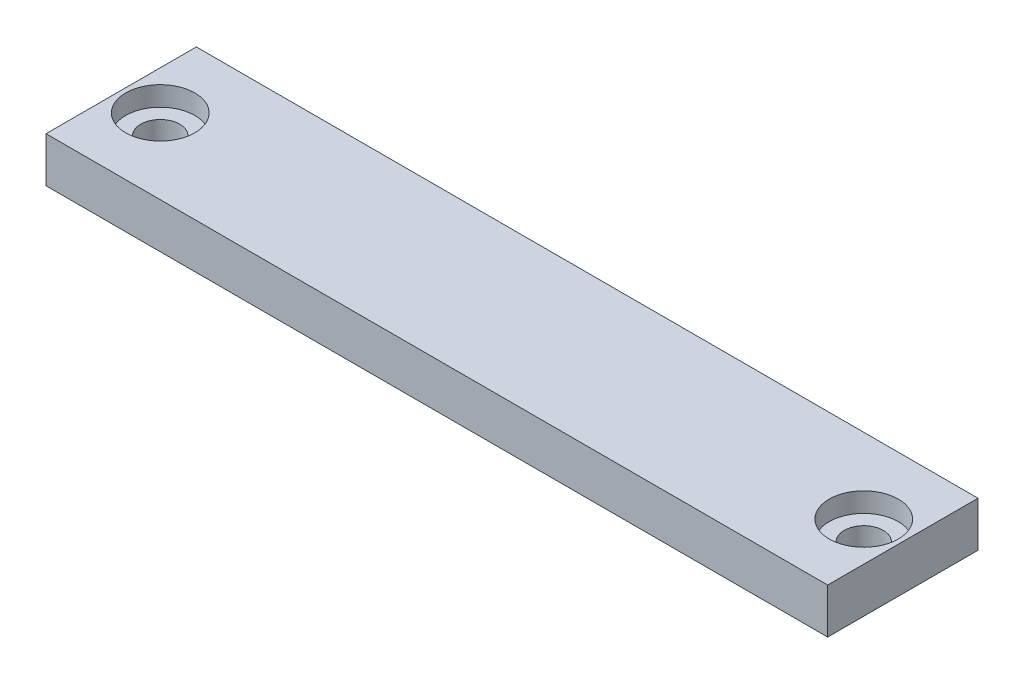
ISO-10303-21;
HEADER;
FILE_DESCRIPTION(('STEP AP214'),'2;1');
FILE_NAME('part.step','',(''),(''),'','','');
FILE_SCHEMA(('AUTOMOTIVE_DESIGN { 1 0 10303 214 1 1 1 1 }'));
ENDSEC;
DATA;
#1=APPLICATION_CONTEXT('core data for automotive mechanical design processes');
#2=APPLICATION_PROTOCOL_DEFINITION('international standard','automotive_design',2000,#1);
#3=PRODUCT_CONTEXT('',#1,'mechanical');
#4=PRODUCT('Part','Part','',(#3));
#5=PRODUCT_RELATED_PRODUCT_CATEGORY('part','',(#4));
#6=PRODUCT_DEFINITION_FORMATION('','',#4);
#7=PRODUCT_DEFINITION_CONTEXT('part definition',#1,'design');
#8=PRODUCT_DEFINITION('design','',#6,#7);
#9=PRODUCT_DEFINITION_SHAPE('','',#8);
#10=(LENGTH_UNIT() NAMED_UNIT(*) SI_UNIT(.MILLI.,.METRE.));
#11=(NAMED_UNIT(*) PLANE_ANGLE_UNIT() SI_UNIT($,.RADIAN.));
#12=(NAMED_UNIT(*) SI_UNIT($,.STERADIAN.) SOLID_ANGLE_UNIT());
#13=UNCERTAINTY_MEASURE_WITH_UNIT(LENGTH_MEASURE(1.E-05),#10,'distance_accuracy_value','');
#14=(GEOMETRIC_REPRESENTATION_CONTEXT(3) GLOBAL_UNCERTAINTY_ASSIGNED_CONTEXT((#13)) GLOBAL_UNIT_ASSIGNED_CONTEXT((#10,
#11,#12)) REPRESENTATION_CONTEXT('',''));
#15=CARTESIAN_POINT('',(0.,0.,0.));
#16=DIRECTION('',(0.,0.,1.));
#17=DIRECTION('',(1.,0.,0.));
#18=AXIS2_PLACEMENT_3D('',#15,#16,#17);
#19=CARTESIAN_POINT('',(23.4,26.,-35.));
#20=DIRECTION('',(0.,-1.,0.));
#21=DIRECTION('',(0.,0.,-1.));
#22=AXIS2_PLACEMENT_3D('',#19,#20,#21);
#23=CYLINDRICAL_SURFACE('',#22,1.3);
#24=CARTESIAN_POINT('',(23.4,21.75,-35.));
#25=DIRECTION('',(0.,1.,0.));
#26=DIRECTION('',(0.,0.,1.));
#27=AXIS2_PLACEMENT_3D('',#24,#25,#26);
#28=CIRCLE('',#27,1.3);
#29=CARTESIAN_POINT('',(23.4,21.75,-33.7));
#30=VERTEX_POINT('',#29);
#31=EDGE_CURVE('E131',#30,#30,#28,.F.);
#32=ORIENTED_EDGE('',*,*,#31,.T.);
#33=EDGE_LOOP('',(#32));
#34=FACE_BOUND('',#33,.T.);
#35=CARTESIAN_POINT('',(23.4,23.45,-35.));
#36=DIRECTION('',(0.,1.,0.));
#37=DIRECTION('',(0.,0.,1.));
#38=AXIS2_PLACEMENT_3D('',#35,#36,#37);
#39=CIRCLE('',#38,1.3);
#40=CARTESIAN_POINT('',(23.4,23.45,-33.7));
#41=VERTEX_POINT('',#40);
#42=EDGE_CURVE('E125',#41,#41,#39,.T.);
#43=ORIENTED_EDGE('',*,*,#42,.T.);
#44=EDGE_LOOP('',(#43));
#45=FACE_BOUND('',#44,.T.);
#46=ADVANCED_FACE('F43',(#34,#45),#23,.F.);
#47=CARTESIAN_POINT('',(-23.4,26.,-35.));
#48=DIRECTION('',(0.,-1.,0.));
#49=DIRECTION('',(0.,0.,-1.));
#50=AXIS2_PLACEMENT_3D('',#47,#48,#49);
#51=CYLINDRICAL_SURFACE('',#50,1.3);
#52=CARTESIAN_POINT('',(-23.4,21.75,-35.));
#53=DIRECTION('',(0.,1.,0.));
#54=DIRECTION('',(0.,0.,1.));
#55=AXIS2_PLACEMENT_3D('',#52,#53,#54);
#56=CIRCLE('',#55,1.3);
#57=CARTESIAN_POINT('',(-23.4,21.75,-33.7));
#58=VERTEX_POINT('',#57);
#59=EDGE_CURVE('E113',#58,#58,#56,.F.);
#60=ORIENTED_EDGE('',*,*,#59,.T.);
#61=EDGE_LOOP('',(#60));
#62=FACE_BOUND('',#61,.T.);
#63=CARTESIAN_POINT('',(-23.4,23.45,-35.));
#64=DIRECTION('',(0.,1.,0.));
#65=DIRECTION('',(0.,0.,1.));
#66=AXIS2_PLACEMENT_3D('',#63,#64,#65);
#67=CIRCLE('',#66,1.3);
#68=CARTESIAN_POINT('',(-23.4,23.45,-33.7));
#69=VERTEX_POINT('',#68);
#70=EDGE_CURVE('E119',#69,#69,#67,.T.);
#71=ORIENTED_EDGE('',*,*,#70,.T.);
#72=EDGE_LOOP('',(#71));
#73=FACE_BOUND('',#72,.T.);
#74=ADVANCED_FACE('F144',(#62,#73),#51,.F.);
#75=CARTESIAN_POINT('',(-26.,21.75,-30.));
#76=DIRECTION('',(1.,0.,0.));
#77=DIRECTION('',(0.,0.,-1.));
#78=AXIS2_PLACEMENT_3D('',#75,#76,#77);
#79=PLANE('',#78);
#80=DIRECTION('',(0.,-1.,0.));
#81=VECTOR('',#80,1.);
#82=CARTESIAN_POINT('',(-26.,21.75,-40.));
#83=LINE('',#82,#81);
#84=CARTESIAN_POINT('',(-26.,24.75,-40.));
#85=VERTEX_POINT('',#84);
#86=CARTESIAN_POINT('',(-26.,21.75,-40.));
#87=VERTEX_POINT('',#86);
#88=EDGE_CURVE('E110',#85,#87,#83,.T.);
#89=ORIENTED_EDGE('',*,*,#88,.T.);
#90=DIRECTION('',(0.,0.,-1.));
#91=VECTOR('',#90,1.);
#92=CARTESIAN_POINT('',(-26.,21.75,-30.));
#93=LINE('',#92,#91);
#94=CARTESIAN_POINT('',(-26.,21.75,-30.));
#95=VERTEX_POINT('',#94);
#96=EDGE_CURVE('E11',#95,#87,#93,.T.);
#97=ORIENTED_EDGE('',*,*,#96,.F.);
#98=DIRECTION('',(0.,-1.,0.));
#99=VECTOR('',#98,1.);
#100=CARTESIAN_POINT('',(-26.,21.75,-30.));
#101=LINE('',#100,#99);
#102=CARTESIAN_POINT('',(-26.,24.75,-30.));
#103=VERTEX_POINT('',#102);
#104=EDGE_CURVE('E97',#103,#95,#101,.T.);
#105=ORIENTED_EDGE('',*,*,#104,.F.);
#106=DIRECTION('',(0.,0.,-1.));
#107=VECTOR('',#106,1.);
#108=CARTESIAN_POINT('',(-26.,24.75,-30.));
#109=LINE('',#108,#107);
#110=EDGE_CURVE('E106',#103,#85,#109,.T.);
#111=ORIENTED_EDGE('',*,*,#110,.T.);
#112=EDGE_LOOP('',(#89,#97,#105,#111));
#113=FACE_BOUND('',#112,.T.);
#114=ADVANCED_FACE('F45',(#113),#79,.F.);
#115=CARTESIAN_POINT('',(-26.,21.75,-30.));
#116=DIRECTION('',(0.,1.,0.));
#117=DIRECTION('',(0.,0.,1.));
#118=AXIS2_PLACEMENT_3D('',#115,#116,#117);
#119=PLANE('',#118);
#120=ORIENTED_EDGE('',*,*,#31,.F.);
#121=EDGE_LOOP('',(#120));
#122=FACE_BOUND('',#121,.T.);
#123=ORIENTED_EDGE('',*,*,#59,.F.);
#124=EDGE_LOOP('',(#123));
#125=FACE_BOUND('',#124,.T.);
#126=DIRECTION('',(1.,0.,0.));
#127=VECTOR('',#126,1.);
#128=CARTESIAN_POINT('',(-26.,21.75,-40.));
#129=LINE('',#128,#127);
#130=CARTESIAN_POINT('',(26.,21.75,-40.));
#131=VERTEX_POINT('',#130);
#132=EDGE_CURVE('E101',#87,#131,#129,.T.);
#133=ORIENTED_EDGE('',*,*,#132,.T.);
#134=DIRECTION('',(0.,0.,-1.));
#135=VECTOR('',#134,1.);
#136=CARTESIAN_POINT('',(26.,21.75,-30.));
#137=LINE('',#136,#135);
#138=CARTESIAN_POINT('',(26.,21.75,-30.));
#139=VERTEX_POINT('',#138);
#140=EDGE_CURVE('E53',#139,#131,#137,.T.);
#141=ORIENTED_EDGE('',*,*,#140,.F.);
#142=DIRECTION('',(1.,0.,0.));
#143=VECTOR('',#142,1.);
#144=CARTESIAN_POINT('',(-26.,21.75,-30.));
#145=LINE('',#144,#143);
#146=EDGE_CURVE('E92',#95,#139,#145,.T.);
#147=ORIENTED_EDGE('',*,*,#146,.F.);
#148=ORIENTED_EDGE('',*,*,#96,.T.);
#149=EDGE_LOOP('',(#133,#141,#147,#148));
#150=FACE_BOUND('',#149,.T.);
#151=ADVANCED_FACE('F100',(#122,#125,#150),#119,.F.);
#152=CARTESIAN_POINT('',(26.,21.75,-30.));
#153=DIRECTION('',(-1.,0.,0.));
#154=DIRECTION('',(0.,0.,1.));
#155=AXIS2_PLACEMENT_3D('',#152,#153,#154);
#156=PLANE('',#155);
#157=DIRECTION('',(0.,1.,0.));
#158=VECTOR('',#157,1.);
#159=CARTESIAN_POINT('',(26.,21.75,-40.));
#160=LINE('',#159,#158);
#161=CARTESIAN_POINT('',(26.,24.75,-40.));
#162=VERTEX_POINT('',#161);
#163=EDGE_CURVE('E79',#131,#162,#160,.T.);
#164=ORIENTED_EDGE('',*,*,#163,.T.);
#165=DIRECTION('',(0.,0.,-1.));
#166=VECTOR('',#165,1.);
#167=CARTESIAN_POINT('',(26.,24.75,-30.));
#168=LINE('',#167,#166);
#169=CARTESIAN_POINT('',(26.,24.75,-30.));
#170=VERTEX_POINT('',#169);
#171=EDGE_CURVE('E102',#170,#162,#168,.T.);
#172=ORIENTED_EDGE('',*,*,#171,.F.);
#173=DIRECTION('',(0.,1.,0.));
#174=VECTOR('',#173,1.);
#175=CARTESIAN_POINT('',(26.,21.75,-30.));
#176=LINE('',#175,#174);
#177=EDGE_CURVE('E95',#139,#170,#176,.T.);
#178=ORIENTED_EDGE('',*,*,#177,.F.);
#179=ORIENTED_EDGE('',*,*,#140,.T.);
#180=EDGE_LOOP('',(#164,#172,#178,#179));
#181=FACE_BOUND('',#180,.T.);
#182=ADVANCED_FACE('F104',(#181),#156,.F.);
#183=CARTESIAN_POINT('',(-26.,24.75,-30.));
#184=DIRECTION('',(0.,-1.,0.));
#185=DIRECTION('',(0.,0.,-1.));
#186=AXIS2_PLACEMENT_3D('',#183,#184,#185);
#187=PLANE('',#186);
#188=CARTESIAN_POINT('',(23.4,24.75,-35.));
#189=DIRECTION('',(0.,-1.,0.));
#190=DIRECTION('',(0.,0.,-1.));
#191=AXIS2_PLACEMENT_3D('',#188,#189,#190);
#192=CIRCLE('',#191,2.3);
#193=CARTESIAN_POINT('',(23.4,24.75,-37.3));
#194=VERTEX_POINT('',#193);
#195=EDGE_CURVE('E47',#194,#194,#192,.F.);
#196=ORIENTED_EDGE('',*,*,#195,.F.);
#197=EDGE_LOOP('',(#196));
#198=FACE_BOUND('',#197,.T.);
#199=CARTESIAN_POINT('',(-23.4,24.75,-35.));
#200=DIRECTION('',(0.,-1.,0.));
#201=DIRECTION('',(0.,0.,-1.));
#202=AXIS2_PLACEMENT_3D('',#199,#200,#201);
#203=CIRCLE('',#202,2.3);
#204=CARTESIAN_POINT('',(-23.4,24.75,-37.3));
#205=VERTEX_POINT('',#204);
#206=EDGE_CURVE('E122',#205,#205,#203,.F.);
#207=ORIENTED_EDGE('',*,*,#206,.F.);
#208=EDGE_LOOP('',(#207));
#209=FACE_BOUND('',#208,.T.);
#210=DIRECTION('',(-1.,0.,0.));
#211=VECTOR('',#210,1.);
#212=CARTESIAN_POINT('',(-26.,24.75,-40.));
#213=LINE('',#212,#211);
#214=EDGE_CURVE('E85',#162,#85,#213,.T.);
#215=ORIENTED_EDGE('',*,*,#214,.T.);
#216=ORIENTED_EDGE('',*,*,#110,.F.);
#217=DIRECTION('',(-1.,0.,0.));
#218=VECTOR('',#217,1.);
#219=CARTESIAN_POINT('',(-26.,24.75,-30.));
#220=LINE('',#219,#218);
#221=EDGE_CURVE('E62',#170,#103,#220,.T.);
#222=ORIENTED_EDGE('',*,*,#221,.F.);
#223=ORIENTED_EDGE('',*,*,#171,.T.);
#224=EDGE_LOOP('',(#215,#216,#222,#223));
#225=FACE_BOUND('',#224,.T.);
#226=ADVANCED_FACE('F155',(#198,#209,#225),#187,.F.);
#227=CARTESIAN_POINT('',(0.,0.,-30.));
#228=DIRECTION('',(0.,0.,-1.));
#229=DIRECTION('',(-1.,0.,0.));
#230=AXIS2_PLACEMENT_3D('',#227,#228,#229);
#231=PLANE('',#230);
#232=ORIENTED_EDGE('',*,*,#104,.T.);
#233=ORIENTED_EDGE('',*,*,#146,.T.);
#234=ORIENTED_EDGE('',*,*,#177,.T.);
#235=ORIENTED_EDGE('',*,*,#221,.T.);
#236=EDGE_LOOP('',(#232,#233,#234,#235));
#237=FACE_BOUND('',#236,.T.);
#238=ADVANCED_FACE('F93',(#237),#231,.F.);
#239=CARTESIAN_POINT('',(0.,0.,-40.));
#240=DIRECTION('',(0.,0.,-1.));
#241=DIRECTION('',(-1.,0.,0.));
#242=AXIS2_PLACEMENT_3D('',#239,#240,#241);
#243=PLANE('',#242);
#244=ORIENTED_EDGE('',*,*,#88,.F.);
#245=ORIENTED_EDGE('',*,*,#214,.F.);
#246=ORIENTED_EDGE('',*,*,#163,.F.);
#247=ORIENTED_EDGE('',*,*,#132,.F.);
#248=EDGE_LOOP('',(#244,#245,#246,#247));
#249=FACE_BOUND('',#248,.T.);
#250=ADVANCED_FACE('F178',(#249),#243,.T.);
#251=CARTESIAN_POINT('',(-23.4,26.,-35.));
#252=DIRECTION('',(0.,-1.,0.));
#253=DIRECTION('',(0.,0.,-1.));
#254=AXIS2_PLACEMENT_3D('',#251,#252,#253);
#255=CYLINDRICAL_SURFACE('',#254,2.3);
#256=CARTESIAN_POINT('',(-23.4,23.45,-35.));
#257=DIRECTION('',(0.,1.,0.));
#258=DIRECTION('',(0.,0.,1.));
#259=AXIS2_PLACEMENT_3D('',#256,#257,#258);
#260=CIRCLE('',#259,2.3);
#261=CARTESIAN_POINT('',(-23.4,23.45,-32.7));
#262=VERTEX_POINT('',#261);
#263=EDGE_CURVE('E123',#262,#262,#260,.T.);
#264=ORIENTED_EDGE('',*,*,#263,.F.);
#265=EDGE_LOOP('',(#264));
#266=FACE_BOUND('',#265,.T.);
#267=ORIENTED_EDGE('',*,*,#206,.T.);
#268=EDGE_LOOP('',(#267));
#269=FACE_BOUND('',#268,.T.);
#270=ADVANCED_FACE('F175',(#266,#269),#255,.F.);
#271=CARTESIAN_POINT('',(-23.4,23.45,-35.));
#272=DIRECTION('',(0.,1.,0.));
#273=DIRECTION('',(0.,0.,1.));
#274=AXIS2_PLACEMENT_3D('',#271,#272,#273);
#275=PLANE('',#274);
#276=ORIENTED_EDGE('',*,*,#70,.F.);
#277=EDGE_LOOP('',(#276));
#278=FACE_BOUND('',#277,.T.);
#279=ORIENTED_EDGE('',*,*,#263,.T.);
#280=EDGE_LOOP('',(#279));
#281=FACE_BOUND('',#280,.T.);
#282=ADVANCED_FACE('F172',(#278,#281),#275,.T.);
#283=CARTESIAN_POINT('',(23.4,26.,-35.));
#284=DIRECTION('',(0.,-1.,0.));
#285=DIRECTION('',(0.,0.,-1.));
#286=AXIS2_PLACEMENT_3D('',#283,#284,#285);
#287=CYLINDRICAL_SURFACE('',#286,2.3);
#288=CARTESIAN_POINT('',(23.4,23.45,-35.));
#289=DIRECTION('',(0.,1.,0.));
#290=DIRECTION('',(0.,0.,1.));
#291=AXIS2_PLACEMENT_3D('',#288,#289,#290);
#292=CIRCLE('',#291,2.3);
#293=CARTESIAN_POINT('',(23.4,23.45,-32.7));
#294=VERTEX_POINT('',#293);
#295=EDGE_CURVE('E127',#294,#294,#292,.T.);
#296=ORIENTED_EDGE('',*,*,#295,.F.);
#297=EDGE_LOOP('',(#296));
#298=FACE_BOUND('',#297,.T.);
#299=ORIENTED_EDGE('',*,*,#195,.T.);
#300=EDGE_LOOP('',(#299));
#301=FACE_BOUND('',#300,.T.);
#302=ADVANCED_FACE('F170',(#298,#301),#287,.F.);
#303=CARTESIAN_POINT('',(23.4,23.45,-35.));
#304=DIRECTION('',(0.,1.,0.));
#305=DIRECTION('',(0.,0.,1.));
#306=AXIS2_PLACEMENT_3D('',#303,#304,#305);
#307=PLANE('',#306);
#308=ORIENTED_EDGE('',*,*,#42,.F.);
#309=EDGE_LOOP('',(#308));
#310=FACE_BOUND('',#309,.T.);
#311=ORIENTED_EDGE('',*,*,#295,.T.);
#312=EDGE_LOOP('',(#311));
#313=FACE_BOUND('',#312,.T.);
#314=ADVANCED_FACE('F194',(#310,#313),#307,.T.);
#315=CLOSED_SHELL('',(#46,#74,#114,#151,#182,#226,#238,#250,#270,#282,#302,#314));
#316=MANIFOLD_SOLID_BREP('B2',#315);
#317=ADVANCED_BREP_SHAPE_REPRESENTATION('',(#18,#316),#14);
#318=SHAPE_DEFINITION_REPRESENTATION(#9,#317);
ENDSEC;
END-ISO-10303-21;
